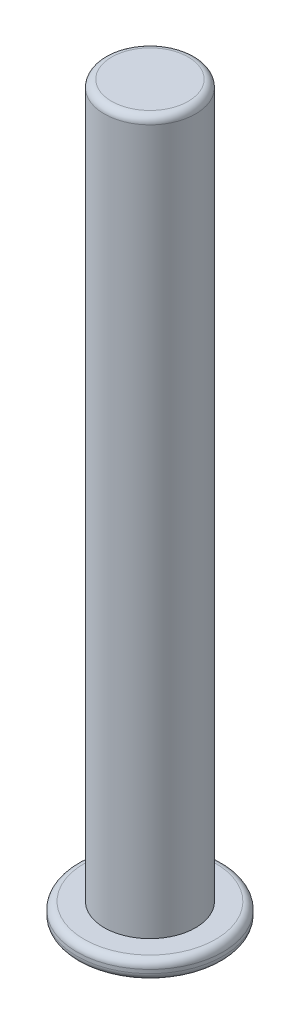
ISO-10303-21;
HEADER;
FILE_DESCRIPTION(('STEP AP214'),'2;1');
FILE_NAME('part.step','',(''),(''),'','','');
FILE_SCHEMA(('AUTOMOTIVE_DESIGN { 1 0 10303 214 1 1 1 1 }'));
ENDSEC;
DATA;
#1=APPLICATION_CONTEXT('core data for automotive mechanical design processes');
#2=APPLICATION_PROTOCOL_DEFINITION('international standard','automotive_design',2000,#1);
#3=PRODUCT_CONTEXT('',#1,'mechanical');
#4=PRODUCT('Part','Part','',(#3));
#5=PRODUCT_RELATED_PRODUCT_CATEGORY('part','',(#4));
#6=PRODUCT_DEFINITION_FORMATION('','',#4);
#7=PRODUCT_DEFINITION_CONTEXT('part definition',#1,'design');
#8=PRODUCT_DEFINITION('design','',#6,#7);
#9=PRODUCT_DEFINITION_SHAPE('','',#8);
#10=(LENGTH_UNIT() NAMED_UNIT(*) SI_UNIT(.MILLI.,.METRE.));
#11=(NAMED_UNIT(*) PLANE_ANGLE_UNIT() SI_UNIT($,.RADIAN.));
#12=(NAMED_UNIT(*) SI_UNIT($,.STERADIAN.) SOLID_ANGLE_UNIT());
#13=UNCERTAINTY_MEASURE_WITH_UNIT(LENGTH_MEASURE(1.E-05),#10,'distance_accuracy_value','');
#14=(GEOMETRIC_REPRESENTATION_CONTEXT(3) GLOBAL_UNCERTAINTY_ASSIGNED_CONTEXT((#13)) GLOBAL_UNIT_ASSIGNED_CONTEXT((#10,
#11,#12)) REPRESENTATION_CONTEXT('',''));
#15=CARTESIAN_POINT('',(0.,0.,0.));
#16=DIRECTION('',(0.,0.,1.));
#17=DIRECTION('',(1.,0.,0.));
#18=AXIS2_PLACEMENT_3D('',#15,#16,#17);
#19=CARTESIAN_POINT('',(0.,2.,0.));
#20=DIRECTION('',(0.,-1.,0.));
#21=DIRECTION('',(0.,0.,-1.));
#22=AXIS2_PLACEMENT_3D('',#19,#20,#21);
#23=CYLINDRICAL_SURFACE('',#22,8.);
#24=CARTESIAN_POINT('',(0.,1.2,0.));
#25=DIRECTION('',(0.,1.,0.));
#26=DIRECTION('',(0.,0.,1.));
#27=AXIS2_PLACEMENT_3D('',#24,#25,#26);
#28=CIRCLE('',#27,8.);
#29=CARTESIAN_POINT('',(0.,1.2,8.));
#30=VERTEX_POINT('',#29);
#31=EDGE_CURVE('E45',#30,#30,#28,.F.);
#32=ORIENTED_EDGE('',*,*,#31,.T.);
#33=EDGE_LOOP('',(#32));
#34=FACE_BOUND('',#33,.T.);
#35=CARTESIAN_POINT('',(0.,0.8,0.));
#36=DIRECTION('',(0.,1.,0.));
#37=DIRECTION('',(0.,0.,1.));
#38=AXIS2_PLACEMENT_3D('',#35,#36,#37);
#39=CIRCLE('',#38,8.);
#40=CARTESIAN_POINT('',(0.,0.8,8.));
#41=VERTEX_POINT('',#40);
#42=EDGE_CURVE('E50',#41,#41,#39,.T.);
#43=ORIENTED_EDGE('',*,*,#42,.T.);
#44=EDGE_LOOP('',(#43));
#45=FACE_BOUND('',#44,.T.);
#46=ADVANCED_FACE('F37',(#34,#45),#23,.T.);
#47=CARTESIAN_POINT('',(0.,2.,0.));
#48=DIRECTION('',(0.,1.,0.));
#49=DIRECTION('',(0.,0.,1.));
#50=AXIS2_PLACEMENT_3D('',#47,#48,#49);
#51=PLANE('',#50);
#52=CARTESIAN_POINT('',(0.,2.,0.));
#53=DIRECTION('',(0.,1.,0.));
#54=DIRECTION('',(0.,0.,1.));
#55=AXIS2_PLACEMENT_3D('',#52,#53,#54);
#56=CIRCLE('',#55,7.2);
#57=CARTESIAN_POINT('',(0.,2.,7.2));
#58=VERTEX_POINT('',#57);
#59=EDGE_CURVE('E55',#58,#58,#56,.T.);
#60=ORIENTED_EDGE('',*,*,#59,.T.);
#61=EDGE_LOOP('',(#60));
#62=FACE_BOUND('',#61,.T.);
#63=CARTESIAN_POINT('',(0.,2.,0.));
#64=DIRECTION('',(0.,1.,0.));
#65=DIRECTION('',(0.,0.,1.));
#66=AXIS2_PLACEMENT_3D('',#63,#64,#65);
#67=CIRCLE('',#66,5.);
#68=CARTESIAN_POINT('',(0.,2.,5.));
#69=VERTEX_POINT('',#68);
#70=EDGE_CURVE('E69',#69,#69,#67,.F.);
#71=ORIENTED_EDGE('',*,*,#70,.T.);
#72=EDGE_LOOP('',(#71));
#73=FACE_BOUND('',#72,.T.);
#74=ADVANCED_FACE('F74',(#62,#73),#51,.T.);
#75=CARTESIAN_POINT('',(0.,0.,0.));
#76=DIRECTION('',(0.,1.,0.));
#77=DIRECTION('',(0.,0.,1.));
#78=AXIS2_PLACEMENT_3D('',#75,#76,#77);
#79=PLANE('',#78);
#80=CARTESIAN_POINT('',(0.,0.,0.));
#81=DIRECTION('',(0.,1.,0.));
#82=DIRECTION('',(0.,0.,1.));
#83=AXIS2_PLACEMENT_3D('',#80,#81,#82);
#84=CIRCLE('',#83,7.2);
#85=CARTESIAN_POINT('',(0.,0.,7.2));
#86=VERTEX_POINT('',#85);
#87=EDGE_CURVE('E10',#86,#86,#84,.F.);
#88=ORIENTED_EDGE('',*,*,#87,.T.);
#89=EDGE_LOOP('',(#88));
#90=FACE_BOUND('',#89,.T.);
#91=ADVANCED_FACE('F79',(#90),#79,.F.);
#92=CARTESIAN_POINT('',(0.,80.,0.));
#93=DIRECTION('',(0.,-1.,0.));
#94=DIRECTION('',(0.,0.,-1.));
#95=AXIS2_PLACEMENT_3D('',#92,#93,#94);
#96=CYLINDRICAL_SURFACE('',#95,5.);
#97=CARTESIAN_POINT('',(0.,79.2,0.));
#98=DIRECTION('',(0.,1.,0.));
#99=DIRECTION('',(0.,0.,1.));
#100=AXIS2_PLACEMENT_3D('',#97,#98,#99);
#101=CIRCLE('',#100,5.);
#102=CARTESIAN_POINT('',(0.,79.2,5.));
#103=VERTEX_POINT('',#102);
#104=EDGE_CURVE('E61',#103,#103,#101,.F.);
#105=ORIENTED_EDGE('',*,*,#104,.T.);
#106=EDGE_LOOP('',(#105));
#107=FACE_BOUND('',#106,.T.);
#108=ORIENTED_EDGE('',*,*,#70,.F.);
#109=EDGE_LOOP('',(#108));
#110=FACE_BOUND('',#109,.T.);
#111=ADVANCED_FACE('F76',(#107,#110),#96,.T.);
#112=CARTESIAN_POINT('',(0.,80.,0.));
#113=DIRECTION('',(0.,1.,0.));
#114=DIRECTION('',(0.,0.,1.));
#115=AXIS2_PLACEMENT_3D('',#112,#113,#114);
#116=PLANE('',#115);
#117=CARTESIAN_POINT('',(0.,80.,0.));
#118=DIRECTION('',(0.,1.,0.));
#119=DIRECTION('',(0.,0.,1.));
#120=AXIS2_PLACEMENT_3D('',#117,#118,#119);
#121=CIRCLE('',#120,4.2);
#122=CARTESIAN_POINT('',(0.,80.,4.2));
#123=VERTEX_POINT('',#122);
#124=EDGE_CURVE('E65',#123,#123,#121,.T.);
#125=ORIENTED_EDGE('',*,*,#124,.T.);
#126=EDGE_LOOP('',(#125));
#127=FACE_BOUND('',#126,.T.);
#128=ADVANCED_FACE('F78',(#127),#116,.T.);
#129=CARTESIAN_POINT('',(0.,79.2,0.));
#130=DIRECTION('',(0.,1.,0.));
#131=DIRECTION('',(0.,0.,1.));
#132=AXIS2_PLACEMENT_3D('',#129,#130,#131);
#133=TOROIDAL_SURFACE('',#132,4.2,0.8);
#134=ORIENTED_EDGE('',*,*,#104,.F.);
#135=EDGE_LOOP('',(#134));
#136=FACE_BOUND('',#135,.T.);
#137=ORIENTED_EDGE('',*,*,#124,.F.);
#138=EDGE_LOOP('',(#137));
#139=FACE_BOUND('',#138,.T.);
#140=ADVANCED_FACE('F86',(#136,#139),#133,.T.);
#141=CARTESIAN_POINT('',(0.,1.2,0.));
#142=DIRECTION('',(0.,1.,0.));
#143=DIRECTION('',(0.,0.,1.));
#144=AXIS2_PLACEMENT_3D('',#141,#142,#143);
#145=TOROIDAL_SURFACE('',#144,7.2,0.8);
#146=ORIENTED_EDGE('',*,*,#31,.F.);
#147=EDGE_LOOP('',(#146));
#148=FACE_BOUND('',#147,.T.);
#149=ORIENTED_EDGE('',*,*,#59,.F.);
#150=EDGE_LOOP('',(#149));
#151=FACE_BOUND('',#150,.T.);
#152=ADVANCED_FACE('F100',(#148,#151),#145,.T.);
#153=CARTESIAN_POINT('',(0.,0.8,0.));
#154=DIRECTION('',(0.,1.,0.));
#155=DIRECTION('',(0.,0.,1.));
#156=AXIS2_PLACEMENT_3D('',#153,#154,#155);
#157=TOROIDAL_SURFACE('',#156,7.2,0.8);
#158=ORIENTED_EDGE('',*,*,#87,.F.);
#159=EDGE_LOOP('',(#158));
#160=FACE_BOUND('',#159,.T.);
#161=ORIENTED_EDGE('',*,*,#42,.F.);
#162=EDGE_LOOP('',(#161));
#163=FACE_BOUND('',#162,.T.);
#164=ADVANCED_FACE('F39',(#160,#163),#157,.T.);
#165=CLOSED_SHELL('',(#46,#74,#91,#111,#128,#140,#152,#164));
#166=MANIFOLD_SOLID_BREP('B2',#165);
#167=ADVANCED_BREP_SHAPE_REPRESENTATION('',(#18,#166),#14);
#168=SHAPE_DEFINITION_REPRESENTATION(#9,#167);
ENDSEC;
END-ISO-10303-21;
